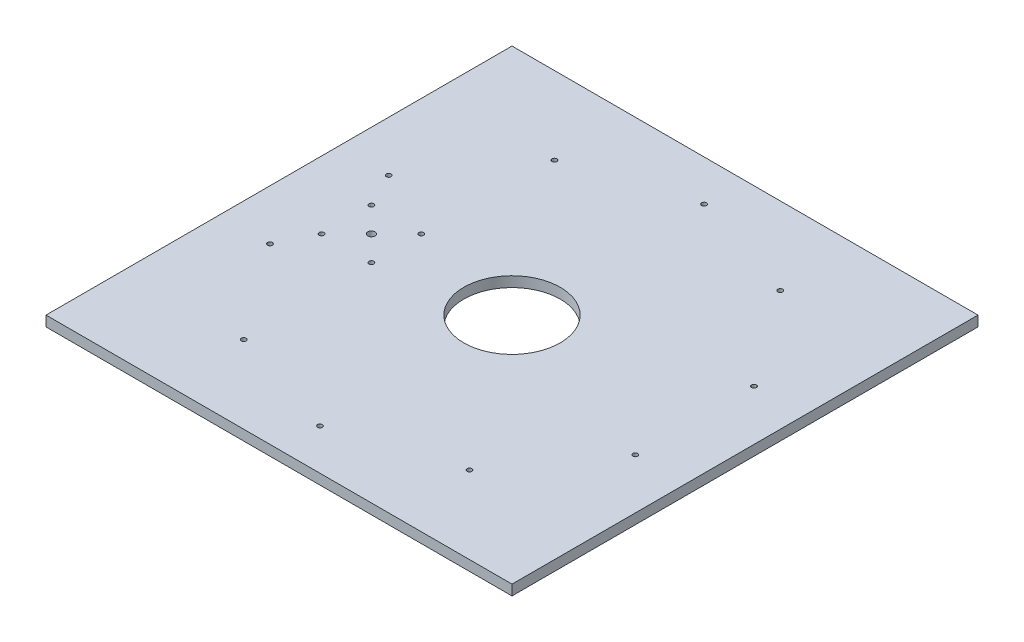
ISO-10303-21;
HEADER;
FILE_DESCRIPTION(('STEP AP214'),'2;1');
FILE_NAME('part.step','',(''),(''),'','','');
FILE_SCHEMA(('AUTOMOTIVE_DESIGN { 1 0 10303 214 1 1 1 1 }'));
ENDSEC;
DATA;
#1=APPLICATION_CONTEXT('core data for automotive mechanical design processes');
#2=APPLICATION_PROTOCOL_DEFINITION('international standard','automotive_design',2000,#1);
#3=PRODUCT_CONTEXT('',#1,'mechanical');
#4=PRODUCT('Part','Part','',(#3));
#5=PRODUCT_RELATED_PRODUCT_CATEGORY('part','',(#4));
#6=PRODUCT_DEFINITION_FORMATION('','',#4);
#7=PRODUCT_DEFINITION_CONTEXT('part definition',#1,'design');
#8=PRODUCT_DEFINITION('design','',#6,#7);
#9=PRODUCT_DEFINITION_SHAPE('','',#8);
#10=(LENGTH_UNIT() NAMED_UNIT(*) SI_UNIT(.MILLI.,.METRE.));
#11=(NAMED_UNIT(*) PLANE_ANGLE_UNIT() SI_UNIT($,.RADIAN.));
#12=(NAMED_UNIT(*) SI_UNIT($,.STERADIAN.) SOLID_ANGLE_UNIT());
#13=UNCERTAINTY_MEASURE_WITH_UNIT(LENGTH_MEASURE(1.E-05),#10,'distance_accuracy_value','');
#14=(GEOMETRIC_REPRESENTATION_CONTEXT(3) GLOBAL_UNCERTAINTY_ASSIGNED_CONTEXT((#13)) GLOBAL_UNIT_ASSIGNED_CONTEXT((#10,
#11,#12)) REPRESENTATION_CONTEXT('',''));
#15=CARTESIAN_POINT('',(0.,0.,0.));
#16=DIRECTION('',(0.,0.,1.));
#17=DIRECTION('',(1.,0.,0.));
#18=AXIS2_PLACEMENT_3D('',#15,#16,#17);
#19=CARTESIAN_POINT('',(-145.,6.4,145.));
#20=DIRECTION('',(1.,0.,0.));
#21=DIRECTION('',(0.,0.,-1.));
#22=AXIS2_PLACEMENT_3D('',#19,#20,#21);
#23=PLANE('',#22);
#24=DIRECTION('',(0.,0.,1.));
#25=VECTOR('',#24,1.);
#26=CARTESIAN_POINT('',(-145.,0.,145.));
#27=LINE('',#26,#25);
#28=CARTESIAN_POINT('',(-145.,0.,-145.));
#29=VERTEX_POINT('',#28);
#30=CARTESIAN_POINT('',(-145.,0.,145.));
#31=VERTEX_POINT('',#30);
#32=EDGE_CURVE('E111',#29,#31,#27,.T.);
#33=ORIENTED_EDGE('',*,*,#32,.T.);
#34=DIRECTION('',(0.,-1.,0.));
#35=VECTOR('',#34,1.);
#36=CARTESIAN_POINT('',(-145.,6.4,145.));
#37=LINE('',#36,#35);
#38=CARTESIAN_POINT('',(-145.,6.4,145.));
#39=VERTEX_POINT('',#38);
#40=EDGE_CURVE('E11',#39,#31,#37,.T.);
#41=ORIENTED_EDGE('',*,*,#40,.F.);
#42=DIRECTION('',(0.,0.,1.));
#43=VECTOR('',#42,1.);
#44=CARTESIAN_POINT('',(-145.,6.4,145.));
#45=LINE('',#44,#43);
#46=CARTESIAN_POINT('',(-145.,6.4,-145.));
#47=VERTEX_POINT('',#46);
#48=EDGE_CURVE('E95',#47,#39,#45,.T.);
#49=ORIENTED_EDGE('',*,*,#48,.F.);
#50=DIRECTION('',(0.,-1.,0.));
#51=VECTOR('',#50,1.);
#52=CARTESIAN_POINT('',(-145.,6.4,-145.));
#53=LINE('',#52,#51);
#54=EDGE_CURVE('E107',#47,#29,#53,.T.);
#55=ORIENTED_EDGE('',*,*,#54,.T.);
#56=EDGE_LOOP('',(#33,#41,#49,#55));
#57=FACE_BOUND('',#56,.T.);
#58=ADVANCED_FACE('F43',(#57),#23,.F.);
#59=CARTESIAN_POINT('',(145.,6.4,145.));
#60=DIRECTION('',(0.,0.,-1.));
#61=DIRECTION('',(-1.,0.,0.));
#62=AXIS2_PLACEMENT_3D('',#59,#60,#61);
#63=PLANE('',#62);
#64=DIRECTION('',(1.,0.,0.));
#65=VECTOR('',#64,1.);
#66=CARTESIAN_POINT('',(145.,0.,145.));
#67=LINE('',#66,#65);
#68=CARTESIAN_POINT('',(145.,0.,145.));
#69=VERTEX_POINT('',#68);
#70=EDGE_CURVE('E100',#31,#69,#67,.T.);
#71=ORIENTED_EDGE('',*,*,#70,.T.);
#72=DIRECTION('',(0.,-1.,0.));
#73=VECTOR('',#72,1.);
#74=CARTESIAN_POINT('',(145.,6.4,145.));
#75=LINE('',#74,#73);
#76=CARTESIAN_POINT('',(145.,6.4,145.));
#77=VERTEX_POINT('',#76);
#78=EDGE_CURVE('E52',#77,#69,#75,.T.);
#79=ORIENTED_EDGE('',*,*,#78,.F.);
#80=DIRECTION('',(1.,0.,0.));
#81=VECTOR('',#80,1.);
#82=CARTESIAN_POINT('',(145.,6.4,145.));
#83=LINE('',#82,#81);
#84=EDGE_CURVE('E90',#39,#77,#83,.T.);
#85=ORIENTED_EDGE('',*,*,#84,.F.);
#86=ORIENTED_EDGE('',*,*,#40,.T.);
#87=EDGE_LOOP('',(#71,#79,#85,#86));
#88=FACE_BOUND('',#87,.T.);
#89=ADVANCED_FACE('F99',(#88),#63,.F.);
#90=CARTESIAN_POINT('',(145.,6.4,145.));
#91=DIRECTION('',(-1.,0.,0.));
#92=DIRECTION('',(0.,0.,1.));
#93=AXIS2_PLACEMENT_3D('',#90,#91,#92);
#94=PLANE('',#93);
#95=DIRECTION('',(0.,0.,-1.));
#96=VECTOR('',#95,1.);
#97=CARTESIAN_POINT('',(145.,0.,145.));
#98=LINE('',#97,#96);
#99=CARTESIAN_POINT('',(145.,0.,-145.));
#100=VERTEX_POINT('',#99);
#101=EDGE_CURVE('E77',#69,#100,#98,.T.);
#102=ORIENTED_EDGE('',*,*,#101,.T.);
#103=DIRECTION('',(0.,-1.,0.));
#104=VECTOR('',#103,1.);
#105=CARTESIAN_POINT('',(145.,6.4,-145.));
#106=LINE('',#105,#104);
#107=CARTESIAN_POINT('',(145.,6.4,-145.));
#108=VERTEX_POINT('',#107);
#109=EDGE_CURVE('E102',#108,#100,#106,.T.);
#110=ORIENTED_EDGE('',*,*,#109,.F.);
#111=DIRECTION('',(0.,0.,-1.));
#112=VECTOR('',#111,1.);
#113=CARTESIAN_POINT('',(145.,6.4,145.));
#114=LINE('',#113,#112);
#115=EDGE_CURVE('E93',#77,#108,#114,.T.);
#116=ORIENTED_EDGE('',*,*,#115,.F.);
#117=ORIENTED_EDGE('',*,*,#78,.T.);
#118=EDGE_LOOP('',(#102,#110,#116,#117));
#119=FACE_BOUND('',#118,.T.);
#120=ADVANCED_FACE('F103',(#119),#94,.F.);
#121=CARTESIAN_POINT('',(145.,6.4,-145.));
#122=DIRECTION('',(0.,0.,1.));
#123=DIRECTION('',(1.,0.,0.));
#124=AXIS2_PLACEMENT_3D('',#121,#122,#123);
#125=PLANE('',#124);
#126=DIRECTION('',(-1.,0.,0.));
#127=VECTOR('',#126,1.);
#128=CARTESIAN_POINT('',(145.,0.,-145.));
#129=LINE('',#128,#127);
#130=EDGE_CURVE('E83',#100,#29,#129,.T.);
#131=ORIENTED_EDGE('',*,*,#130,.T.);
#132=ORIENTED_EDGE('',*,*,#54,.F.);
#133=DIRECTION('',(-1.,0.,0.));
#134=VECTOR('',#133,1.);
#135=CARTESIAN_POINT('',(145.,6.4,-145.));
#136=LINE('',#135,#134);
#137=EDGE_CURVE('E60',#108,#47,#136,.T.);
#138=ORIENTED_EDGE('',*,*,#137,.F.);
#139=ORIENTED_EDGE('',*,*,#109,.T.);
#140=EDGE_LOOP('',(#131,#132,#138,#139));
#141=FACE_BOUND('',#140,.T.);
#142=ADVANCED_FACE('F125',(#141),#125,.F.);
#143=CARTESIAN_POINT('',(0.,6.4,0.));
#144=DIRECTION('',(0.,1.,0.));
#145=DIRECTION('',(0.,0.,1.));
#146=AXIS2_PLACEMENT_3D('',#143,#144,#145);
#147=PLANE('',#146);
#148=CARTESIAN_POINT('',(0.,6.4,-119.525));
#149=DIRECTION('',(0.,1.,0.));
#150=DIRECTION('',(0.,0.,1.));
#151=AXIS2_PLACEMENT_3D('',#148,#149,#150);
#152=CIRCLE('',#151,1.5);
#153=CARTESIAN_POINT('',(0.,6.4,-118.025));
#154=VERTEX_POINT('',#153);
#155=EDGE_CURVE('E136',#154,#154,#152,.T.);
#156=ORIENTED_EDGE('',*,*,#155,.F.);
#157=EDGE_LOOP('',(#156));
#158=FACE_BOUND('',#157,.T.);
#159=CARTESIAN_POINT('',(-87.5,6.4,0.));
#160=DIRECTION('',(0.,1.,0.));
#161=DIRECTION('',(0.,0.,1.));
#162=AXIS2_PLACEMENT_3D('',#159,#160,#161);
#163=CIRCLE('',#162,2.25);
#164=CARTESIAN_POINT('',(-87.5,6.4,2.25));
#165=VERTEX_POINT('',#164);
#166=EDGE_CURVE('E193',#165,#165,#163,.T.);
#167=ORIENTED_EDGE('',*,*,#166,.F.);
#168=EDGE_LOOP('',(#167));
#169=FACE_BOUND('',#168,.T.);
#170=CARTESIAN_POINT('',(70.2550322802588,6.4,-96.6977562526686));
#171=DIRECTION('',(0.,1.,0.));
#172=DIRECTION('',(0.,0.,1.));
#173=AXIS2_PLACEMENT_3D('',#170,#171,#172);
#174=CIRCLE('',#173,1.50000000000022);
#175=CARTESIAN_POINT('',(70.2550322802588,6.4,-95.1977562526684));
#176=VERTEX_POINT('',#175);
#177=EDGE_CURVE('E185',#176,#176,#174,.T.);
#178=ORIENTED_EDGE('',*,*,#177,.F.);
#179=EDGE_LOOP('',(#178));
#180=FACE_BOUND('',#179,.T.);
#181=CARTESIAN_POINT('',(113.675030110182,6.4,-36.9352562526704));
#182=DIRECTION('',(0.,1.,0.));
#183=DIRECTION('',(0.,0.,1.));
#184=AXIS2_PLACEMENT_3D('',#181,#182,#183);
#185=CIRCLE('',#184,1.50000000000228);
#186=CARTESIAN_POINT('',(113.675030110182,6.4,-35.4352562526681));
#187=VERTEX_POINT('',#186);
#188=EDGE_CURVE('E177',#187,#187,#185,.T.);
#189=ORIENTED_EDGE('',*,*,#188,.F.);
#190=EDGE_LOOP('',(#189));
#191=FACE_BOUND('',#190,.T.);
#192=CARTESIAN_POINT('',(113.675030110185,6.4,36.9352562526608));
#193=DIRECTION('',(0.,1.,0.));
#194=DIRECTION('',(0.,0.,1.));
#195=AXIS2_PLACEMENT_3D('',#192,#193,#194);
#196=CIRCLE('',#195,1.50000000000544);
#197=CARTESIAN_POINT('',(113.675030110185,6.4,38.4352562526662));
#198=VERTEX_POINT('',#197);
#199=EDGE_CURVE('E169',#198,#198,#196,.T.);
#200=ORIENTED_EDGE('',*,*,#199,.F.);
#201=EDGE_LOOP('',(#200));
#202=FACE_BOUND('',#201,.T.);
#203=CARTESIAN_POINT('',(70.255032280267,6.4,96.6977562526626));
#204=DIRECTION('',(0.,1.,0.));
#205=DIRECTION('',(0.,0.,1.));
#206=AXIS2_PLACEMENT_3D('',#203,#204,#205);
#207=CIRCLE('',#206,1.50000000000855);
#208=CARTESIAN_POINT('',(70.255032280267,6.4,98.1977562526712));
#209=VERTEX_POINT('',#208);
#210=EDGE_CURVE('E161',#209,#209,#207,.T.);
#211=ORIENTED_EDGE('',*,*,#210,.F.);
#212=EDGE_LOOP('',(#211));
#213=FACE_BOUND('',#212,.T.);
#214=CARTESIAN_POINT('',(1.01467311922842E-11,6.4,119.525));
#215=DIRECTION('',(0.,1.,0.));
#216=DIRECTION('',(0.,0.,1.));
#217=AXIS2_PLACEMENT_3D('',#214,#215,#216);
#218=CIRCLE('',#217,1.5000000000105);
#219=CARTESIAN_POINT('',(1.01467311922842E-11,6.4,121.025000000011));
#220=VERTEX_POINT('',#219);
#221=EDGE_CURVE('E153',#220,#220,#218,.T.);
#222=ORIENTED_EDGE('',*,*,#221,.F.);
#223=EDGE_LOOP('',(#222));
#224=FACE_BOUND('',#223,.T.);
#225=CARTESIAN_POINT('',(-70.2550322802487,6.4,96.6977562526686));
#226=DIRECTION('',(0.,1.,0.));
#227=DIRECTION('',(0.,0.,1.));
#228=AXIS2_PLACEMENT_3D('',#225,#226,#227);
#229=CIRCLE('',#228,1.50000000001064);
#230=CARTESIAN_POINT('',(-70.2550322802487,6.4,98.1977562526792));
#231=VERTEX_POINT('',#230);
#232=EDGE_CURVE('E144',#231,#231,#229,.T.);
#233=ORIENTED_EDGE('',*,*,#232,.F.);
#234=EDGE_LOOP('',(#233));
#235=FACE_BOUND('',#234,.T.);
#236=CARTESIAN_POINT('',(-103.,6.4,15.5));
#237=DIRECTION('',(0.,1.,0.));
#238=DIRECTION('',(0.,0.,1.));
#239=AXIS2_PLACEMENT_3D('',#236,#237,#238);
#240=CIRCLE('',#239,1.5);
#241=CARTESIAN_POINT('',(-103.,6.4,17.));
#242=VERTEX_POINT('',#241);
#243=EDGE_CURVE('E240',#242,#242,#240,.T.);
#244=ORIENTED_EDGE('',*,*,#243,.F.);
#245=EDGE_LOOP('',(#244));
#246=FACE_BOUND('',#245,.T.);
#247=CARTESIAN_POINT('',(-72.,6.4,15.5));
#248=DIRECTION('',(0.,1.,0.));
#249=DIRECTION('',(0.,0.,1.));
#250=AXIS2_PLACEMENT_3D('',#247,#248,#249);
#251=CIRCLE('',#250,1.5);
#252=CARTESIAN_POINT('',(-72.,6.4,17.));
#253=VERTEX_POINT('',#252);
#254=EDGE_CURVE('E248',#253,#253,#251,.T.);
#255=ORIENTED_EDGE('',*,*,#254,.F.);
#256=EDGE_LOOP('',(#255));
#257=FACE_BOUND('',#256,.T.);
#258=CARTESIAN_POINT('',(-72.,6.4,-15.5));
#259=DIRECTION('',(0.,1.,0.));
#260=DIRECTION('',(0.,0.,1.));
#261=AXIS2_PLACEMENT_3D('',#258,#259,#260);
#262=CIRCLE('',#261,1.50000000000001);
#263=CARTESIAN_POINT('',(-72.,6.4,-14.));
#264=VERTEX_POINT('',#263);
#265=EDGE_CURVE('E209',#264,#264,#262,.T.);
#266=ORIENTED_EDGE('',*,*,#265,.F.);
#267=EDGE_LOOP('',(#266));
#268=FACE_BOUND('',#267,.T.);
#269=CARTESIAN_POINT('',(-103.,6.4,-15.5));
#270=DIRECTION('',(0.,1.,0.));
#271=DIRECTION('',(0.,0.,1.));
#272=AXIS2_PLACEMENT_3D('',#269,#270,#271);
#273=CIRCLE('',#272,1.5);
#274=CARTESIAN_POINT('',(-103.,6.4,-14.));
#275=VERTEX_POINT('',#274);
#276=EDGE_CURVE('E208',#275,#275,#273,.T.);
#277=ORIENTED_EDGE('',*,*,#276,.F.);
#278=EDGE_LOOP('',(#277));
#279=FACE_BOUND('',#278,.T.);
#280=CARTESIAN_POINT('',(-70.2550322802569,6.4,-96.6977562526626));
#281=DIRECTION('',(0.,1.,0.));
#282=DIRECTION('',(0.,0.,1.));
#283=AXIS2_PLACEMENT_3D('',#280,#281,#282);
#284=CIRCLE('',#283,1.50000000000331);
#285=CARTESIAN_POINT('',(-70.2550322802569,6.4,-95.1977562526593));
#286=VERTEX_POINT('',#285);
#287=EDGE_CURVE('E217',#286,#286,#284,.T.);
#288=ORIENTED_EDGE('',*,*,#287,.F.);
#289=EDGE_LOOP('',(#288));
#290=FACE_BOUND('',#289,.T.);
#291=CARTESIAN_POINT('',(-113.675030110175,6.4,-36.9352562526607));
#292=DIRECTION('',(0.,1.,0.));
#293=DIRECTION('',(0.,0.,1.));
#294=AXIS2_PLACEMENT_3D('',#291,#292,#293);
#295=CIRCLE('',#294,1.50000000000608);
#296=CARTESIAN_POINT('',(-113.675030110175,6.4,-35.4352562526547));
#297=VERTEX_POINT('',#296);
#298=EDGE_CURVE('E225',#297,#297,#295,.T.);
#299=ORIENTED_EDGE('',*,*,#298,.F.);
#300=EDGE_LOOP('',(#299));
#301=FACE_BOUND('',#300,.T.);
#302=CARTESIAN_POINT('',(-113.675030110172,6.4,36.9352562526704));
#303=DIRECTION('',(0.,1.,0.));
#304=DIRECTION('',(0.,0.,1.));
#305=AXIS2_PLACEMENT_3D('',#302,#303,#304);
#306=CIRCLE('',#305,1.50000000000887);
#307=CARTESIAN_POINT('',(-113.675030110172,6.4,38.4352562526793));
#308=VERTEX_POINT('',#307);
#309=EDGE_CURVE('E145',#308,#308,#306,.T.);
#310=ORIENTED_EDGE('',*,*,#309,.F.);
#311=EDGE_LOOP('',(#310));
#312=FACE_BOUND('',#311,.T.);
#313=CARTESIAN_POINT('',(0.,6.4,0.));
#314=DIRECTION('',(0.,1.,0.));
#315=DIRECTION('',(0.,0.,1.));
#316=AXIS2_PLACEMENT_3D('',#313,#314,#315);
#317=CIRCLE('',#316,30.);
#318=CARTESIAN_POINT('',(0.,6.4,30.));
#319=VERTEX_POINT('',#318);
#320=EDGE_CURVE('E132',#319,#319,#317,.T.);
#321=ORIENTED_EDGE('',*,*,#320,.F.);
#322=EDGE_LOOP('',(#321));
#323=FACE_BOUND('',#322,.T.);
#324=ORIENTED_EDGE('',*,*,#48,.T.);
#325=ORIENTED_EDGE('',*,*,#84,.T.);
#326=ORIENTED_EDGE('',*,*,#115,.T.);
#327=ORIENTED_EDGE('',*,*,#137,.T.);
#328=EDGE_LOOP('',(#324,#325,#326,#327));
#329=FACE_BOUND('',#328,.T.);
#330=ADVANCED_FACE('F91',(#158,#169,#180,#191,#202,#213,#224,#235,#246,#257,#268,#279,#290,#301,
#312,#323,#329),#147,.T.);
#331=CARTESIAN_POINT('',(0.,0.,0.));
#332=DIRECTION('',(0.,1.,0.));
#333=DIRECTION('',(0.,0.,1.));
#334=AXIS2_PLACEMENT_3D('',#331,#332,#333);
#335=PLANE('',#334);
#336=CARTESIAN_POINT('',(0.,0.,-119.525));
#337=DIRECTION('',(0.,1.,0.));
#338=DIRECTION('',(0.,0.,1.));
#339=AXIS2_PLACEMENT_3D('',#336,#337,#338);
#340=CIRCLE('',#339,1.5);
#341=CARTESIAN_POINT('',(0.,0.,-118.025));
#342=VERTEX_POINT('',#341);
#343=EDGE_CURVE('E197',#342,#342,#340,.T.);
#344=ORIENTED_EDGE('',*,*,#343,.T.);
#345=EDGE_LOOP('',(#344));
#346=FACE_BOUND('',#345,.T.);
#347=CARTESIAN_POINT('',(-87.5,0.,0.));
#348=DIRECTION('',(0.,1.,0.));
#349=DIRECTION('',(0.,0.,1.));
#350=AXIS2_PLACEMENT_3D('',#347,#348,#349);
#351=CIRCLE('',#350,2.25);
#352=CARTESIAN_POINT('',(-87.5,0.,2.25));
#353=VERTEX_POINT('',#352);
#354=EDGE_CURVE('E189',#353,#353,#351,.T.);
#355=ORIENTED_EDGE('',*,*,#354,.T.);
#356=EDGE_LOOP('',(#355));
#357=FACE_BOUND('',#356,.T.);
#358=CARTESIAN_POINT('',(70.2550322802588,0.,-96.6977562526686));
#359=DIRECTION('',(0.,1.,0.));
#360=DIRECTION('',(0.,0.,1.));
#361=AXIS2_PLACEMENT_3D('',#358,#359,#360);
#362=CIRCLE('',#361,1.50000000000022);
#363=CARTESIAN_POINT('',(70.2550322802588,0.,-95.1977562526684));
#364=VERTEX_POINT('',#363);
#365=EDGE_CURVE('E181',#364,#364,#362,.T.);
#366=ORIENTED_EDGE('',*,*,#365,.T.);
#367=EDGE_LOOP('',(#366));
#368=FACE_BOUND('',#367,.T.);
#369=CARTESIAN_POINT('',(113.675030110182,0.,-36.9352562526704));
#370=DIRECTION('',(0.,1.,0.));
#371=DIRECTION('',(0.,0.,1.));
#372=AXIS2_PLACEMENT_3D('',#369,#370,#371);
#373=CIRCLE('',#372,1.50000000000228);
#374=CARTESIAN_POINT('',(113.675030110182,0.,-35.4352562526681));
#375=VERTEX_POINT('',#374);
#376=EDGE_CURVE('E173',#375,#375,#373,.T.);
#377=ORIENTED_EDGE('',*,*,#376,.T.);
#378=EDGE_LOOP('',(#377));
#379=FACE_BOUND('',#378,.T.);
#380=CARTESIAN_POINT('',(113.675030110185,0.,36.9352562526608));
#381=DIRECTION('',(0.,1.,0.));
#382=DIRECTION('',(0.,0.,1.));
#383=AXIS2_PLACEMENT_3D('',#380,#381,#382);
#384=CIRCLE('',#383,1.50000000000544);
#385=CARTESIAN_POINT('',(113.675030110185,0.,38.4352562526662));
#386=VERTEX_POINT('',#385);
#387=EDGE_CURVE('E165',#386,#386,#384,.T.);
#388=ORIENTED_EDGE('',*,*,#387,.T.);
#389=EDGE_LOOP('',(#388));
#390=FACE_BOUND('',#389,.T.);
#391=CARTESIAN_POINT('',(70.255032280267,0.,96.6977562526626));
#392=DIRECTION('',(0.,1.,0.));
#393=DIRECTION('',(0.,0.,1.));
#394=AXIS2_PLACEMENT_3D('',#391,#392,#393);
#395=CIRCLE('',#394,1.50000000000855);
#396=CARTESIAN_POINT('',(70.255032280267,0.,98.1977562526712));
#397=VERTEX_POINT('',#396);
#398=EDGE_CURVE('E157',#397,#397,#395,.T.);
#399=ORIENTED_EDGE('',*,*,#398,.T.);
#400=EDGE_LOOP('',(#399));
#401=FACE_BOUND('',#400,.T.);
#402=CARTESIAN_POINT('',(1.01467311922842E-11,0.,119.525));
#403=DIRECTION('',(0.,1.,0.));
#404=DIRECTION('',(0.,0.,1.));
#405=AXIS2_PLACEMENT_3D('',#402,#403,#404);
#406=CIRCLE('',#405,1.5000000000105);
#407=CARTESIAN_POINT('',(1.01467311922842E-11,0.,121.025000000011));
#408=VERTEX_POINT('',#407);
#409=EDGE_CURVE('E149',#408,#408,#406,.T.);
#410=ORIENTED_EDGE('',*,*,#409,.T.);
#411=EDGE_LOOP('',(#410));
#412=FACE_BOUND('',#411,.T.);
#413=CARTESIAN_POINT('',(-70.2550322802487,0.,96.6977562526686));
#414=DIRECTION('',(0.,1.,0.));
#415=DIRECTION('',(0.,0.,1.));
#416=AXIS2_PLACEMENT_3D('',#413,#414,#415);
#417=CIRCLE('',#416,1.50000000001064);
#418=CARTESIAN_POINT('',(-70.2550322802487,0.,98.1977562526792));
#419=VERTEX_POINT('',#418);
#420=EDGE_CURVE('E140',#419,#419,#417,.T.);
#421=ORIENTED_EDGE('',*,*,#420,.T.);
#422=EDGE_LOOP('',(#421));
#423=FACE_BOUND('',#422,.T.);
#424=CARTESIAN_POINT('',(-103.,0.,15.5));
#425=DIRECTION('',(0.,1.,0.));
#426=DIRECTION('',(0.,0.,1.));
#427=AXIS2_PLACEMENT_3D('',#424,#425,#426);
#428=CIRCLE('',#427,1.5);
#429=CARTESIAN_POINT('',(-103.,0.,17.));
#430=VERTEX_POINT('',#429);
#431=EDGE_CURVE('E236',#430,#430,#428,.T.);
#432=ORIENTED_EDGE('',*,*,#431,.T.);
#433=EDGE_LOOP('',(#432));
#434=FACE_BOUND('',#433,.T.);
#435=CARTESIAN_POINT('',(-72.,0.,15.5));
#436=DIRECTION('',(0.,1.,0.));
#437=DIRECTION('',(0.,0.,1.));
#438=AXIS2_PLACEMENT_3D('',#435,#436,#437);
#439=CIRCLE('',#438,1.5);
#440=CARTESIAN_POINT('',(-72.,0.,17.));
#441=VERTEX_POINT('',#440);
#442=EDGE_CURVE('E244',#441,#441,#439,.T.);
#443=ORIENTED_EDGE('',*,*,#442,.T.);
#444=EDGE_LOOP('',(#443));
#445=FACE_BOUND('',#444,.T.);
#446=CARTESIAN_POINT('',(-72.,0.,-15.5));
#447=DIRECTION('',(0.,1.,0.));
#448=DIRECTION('',(0.,0.,1.));
#449=AXIS2_PLACEMENT_3D('',#446,#447,#448);
#450=CIRCLE('',#449,1.50000000000001);
#451=CARTESIAN_POINT('',(-72.,0.,-14.));
#452=VERTEX_POINT('',#451);
#453=EDGE_CURVE('E252',#452,#452,#450,.T.);
#454=ORIENTED_EDGE('',*,*,#453,.T.);
#455=EDGE_LOOP('',(#454));
#456=FACE_BOUND('',#455,.T.);
#457=CARTESIAN_POINT('',(-103.,0.,-15.5));
#458=DIRECTION('',(0.,1.,0.));
#459=DIRECTION('',(0.,0.,1.));
#460=AXIS2_PLACEMENT_3D('',#457,#458,#459);
#461=CIRCLE('',#460,1.5);
#462=CARTESIAN_POINT('',(-103.,0.,-14.));
#463=VERTEX_POINT('',#462);
#464=EDGE_CURVE('E204',#463,#463,#461,.T.);
#465=ORIENTED_EDGE('',*,*,#464,.T.);
#466=EDGE_LOOP('',(#465));
#467=FACE_BOUND('',#466,.T.);
#468=CARTESIAN_POINT('',(-70.2550322802569,0.,-96.6977562526626));
#469=DIRECTION('',(0.,1.,0.));
#470=DIRECTION('',(0.,0.,1.));
#471=AXIS2_PLACEMENT_3D('',#468,#469,#470);
#472=CIRCLE('',#471,1.50000000000331);
#473=CARTESIAN_POINT('',(-70.2550322802569,0.,-95.1977562526593));
#474=VERTEX_POINT('',#473);
#475=EDGE_CURVE('E213',#474,#474,#472,.T.);
#476=ORIENTED_EDGE('',*,*,#475,.T.);
#477=EDGE_LOOP('',(#476));
#478=FACE_BOUND('',#477,.T.);
#479=CARTESIAN_POINT('',(-113.675030110175,0.,-36.9352562526607));
#480=DIRECTION('',(0.,1.,0.));
#481=DIRECTION('',(0.,0.,1.));
#482=AXIS2_PLACEMENT_3D('',#479,#480,#481);
#483=CIRCLE('',#482,1.50000000000608);
#484=CARTESIAN_POINT('',(-113.675030110175,0.,-35.4352562526547));
#485=VERTEX_POINT('',#484);
#486=EDGE_CURVE('E221',#485,#485,#483,.T.);
#487=ORIENTED_EDGE('',*,*,#486,.T.);
#488=EDGE_LOOP('',(#487));
#489=FACE_BOUND('',#488,.T.);
#490=CARTESIAN_POINT('',(-113.675030110172,0.,36.9352562526704));
#491=DIRECTION('',(0.,1.,0.));
#492=DIRECTION('',(0.,0.,1.));
#493=AXIS2_PLACEMENT_3D('',#490,#491,#492);
#494=CIRCLE('',#493,1.50000000000887);
#495=CARTESIAN_POINT('',(-113.675030110172,0.,38.4352562526793));
#496=VERTEX_POINT('',#495);
#497=EDGE_CURVE('E229',#496,#496,#494,.T.);
#498=ORIENTED_EDGE('',*,*,#497,.T.);
#499=EDGE_LOOP('',(#498));
#500=FACE_BOUND('',#499,.T.);
#501=CARTESIAN_POINT('',(0.,0.,0.));
#502=DIRECTION('',(0.,1.,0.));
#503=DIRECTION('',(0.,0.,1.));
#504=AXIS2_PLACEMENT_3D('',#501,#502,#503);
#505=CIRCLE('',#504,30.);
#506=CARTESIAN_POINT('',(0.,0.,30.));
#507=VERTEX_POINT('',#506);
#508=EDGE_CURVE('E115',#507,#507,#505,.T.);
#509=ORIENTED_EDGE('',*,*,#508,.T.);
#510=EDGE_LOOP('',(#509));
#511=FACE_BOUND('',#510,.T.);
#512=ORIENTED_EDGE('',*,*,#32,.F.);
#513=ORIENTED_EDGE('',*,*,#130,.F.);
#514=ORIENTED_EDGE('',*,*,#101,.F.);
#515=ORIENTED_EDGE('',*,*,#70,.F.);
#516=EDGE_LOOP('',(#512,#513,#514,#515));
#517=FACE_BOUND('',#516,.T.);
#518=ADVANCED_FACE('F128',(#346,#357,#368,#379,#390,#401,#412,#423,#434,#445,#456,#467,#478,
#489,#500,#511,#517),#335,.F.);
#519=CARTESIAN_POINT('',(0.,0.,0.));
#520=DIRECTION('',(0.,1.,0.));
#521=DIRECTION('',(0.,0.,1.));
#522=AXIS2_PLACEMENT_3D('',#519,#520,#521);
#523=CYLINDRICAL_SURFACE('',#522,30.);
#524=ORIENTED_EDGE('',*,*,#508,.F.);
#525=EDGE_LOOP('',(#524));
#526=FACE_BOUND('',#525,.T.);
#527=ORIENTED_EDGE('',*,*,#320,.T.);
#528=EDGE_LOOP('',(#527));
#529=FACE_BOUND('',#528,.T.);
#530=ADVANCED_FACE('F276',(#526,#529),#523,.F.);
#531=CARTESIAN_POINT('',(-113.675030110172,0.,36.9352562526704));
#532=DIRECTION('',(0.,1.,0.));
#533=DIRECTION('',(0.,0.,1.));
#534=AXIS2_PLACEMENT_3D('',#531,#532,#533);
#535=CYLINDRICAL_SURFACE('',#534,1.50000000000887);
#536=ORIENTED_EDGE('',*,*,#497,.F.);
#537=EDGE_LOOP('',(#536));
#538=FACE_BOUND('',#537,.T.);
#539=ORIENTED_EDGE('',*,*,#309,.T.);
#540=EDGE_LOOP('',(#539));
#541=FACE_BOUND('',#540,.T.);
#542=ADVANCED_FACE('F278',(#538,#541),#535,.F.);
#543=CARTESIAN_POINT('',(-113.675030110175,0.,-36.9352562526607));
#544=DIRECTION('',(0.,1.,0.));
#545=DIRECTION('',(0.,0.,1.));
#546=AXIS2_PLACEMENT_3D('',#543,#544,#545);
#547=CYLINDRICAL_SURFACE('',#546,1.50000000000608);
#548=ORIENTED_EDGE('',*,*,#486,.F.);
#549=EDGE_LOOP('',(#548));
#550=FACE_BOUND('',#549,.T.);
#551=ORIENTED_EDGE('',*,*,#298,.T.);
#552=EDGE_LOOP('',(#551));
#553=FACE_BOUND('',#552,.T.);
#554=ADVANCED_FACE('F285',(#550,#553),#547,.F.);
#555=CARTESIAN_POINT('',(-70.2550322802569,0.,-96.6977562526626));
#556=DIRECTION('',(0.,1.,0.));
#557=DIRECTION('',(0.,0.,1.));
#558=AXIS2_PLACEMENT_3D('',#555,#556,#557);
#559=CYLINDRICAL_SURFACE('',#558,1.50000000000331);
#560=ORIENTED_EDGE('',*,*,#475,.F.);
#561=EDGE_LOOP('',(#560));
#562=FACE_BOUND('',#561,.T.);
#563=ORIENTED_EDGE('',*,*,#287,.T.);
#564=EDGE_LOOP('',(#563));
#565=FACE_BOUND('',#564,.T.);
#566=ADVANCED_FACE('F336',(#562,#565),#559,.F.);
#567=CARTESIAN_POINT('',(-103.,0.,-15.5));
#568=DIRECTION('',(0.,1.,0.));
#569=DIRECTION('',(0.,0.,1.));
#570=AXIS2_PLACEMENT_3D('',#567,#568,#569);
#571=CYLINDRICAL_SURFACE('',#570,1.5);
#572=ORIENTED_EDGE('',*,*,#464,.F.);
#573=EDGE_LOOP('',(#572));
#574=FACE_BOUND('',#573,.T.);
#575=ORIENTED_EDGE('',*,*,#276,.T.);
#576=EDGE_LOOP('',(#575));
#577=FACE_BOUND('',#576,.T.);
#578=ADVANCED_FACE('F347',(#574,#577),#571,.F.);
#579=CARTESIAN_POINT('',(-72.,0.,-15.5));
#580=DIRECTION('',(0.,1.,0.));
#581=DIRECTION('',(0.,0.,1.));
#582=AXIS2_PLACEMENT_3D('',#579,#580,#581);
#583=CYLINDRICAL_SURFACE('',#582,1.50000000000001);
#584=ORIENTED_EDGE('',*,*,#453,.F.);
#585=EDGE_LOOP('',(#584));
#586=FACE_BOUND('',#585,.T.);
#587=ORIENTED_EDGE('',*,*,#265,.T.);
#588=EDGE_LOOP('',(#587));
#589=FACE_BOUND('',#588,.T.);
#590=ADVANCED_FACE('F260',(#586,#589),#583,.F.);
#591=CARTESIAN_POINT('',(-72.,0.,15.5));
#592=DIRECTION('',(0.,1.,0.));
#593=DIRECTION('',(0.,0.,1.));
#594=AXIS2_PLACEMENT_3D('',#591,#592,#593);
#595=CYLINDRICAL_SURFACE('',#594,1.5);
#596=ORIENTED_EDGE('',*,*,#442,.F.);
#597=EDGE_LOOP('',(#596));
#598=FACE_BOUND('',#597,.T.);
#599=ORIENTED_EDGE('',*,*,#254,.T.);
#600=EDGE_LOOP('',(#599));
#601=FACE_BOUND('',#600,.T.);
#602=ADVANCED_FACE('F368',(#598,#601),#595,.F.);
#603=CARTESIAN_POINT('',(-103.,0.,15.5));
#604=DIRECTION('',(0.,1.,0.));
#605=DIRECTION('',(0.,0.,1.));
#606=AXIS2_PLACEMENT_3D('',#603,#604,#605);
#607=CYLINDRICAL_SURFACE('',#606,1.5);
#608=ORIENTED_EDGE('',*,*,#431,.F.);
#609=EDGE_LOOP('',(#608));
#610=FACE_BOUND('',#609,.T.);
#611=ORIENTED_EDGE('',*,*,#243,.T.);
#612=EDGE_LOOP('',(#611));
#613=FACE_BOUND('',#612,.T.);
#614=ADVANCED_FACE('F379',(#610,#613),#607,.F.);
#615=CARTESIAN_POINT('',(-70.2550322802487,0.,96.6977562526686));
#616=DIRECTION('',(0.,1.,0.));
#617=DIRECTION('',(0.,0.,1.));
#618=AXIS2_PLACEMENT_3D('',#615,#616,#617);
#619=CYLINDRICAL_SURFACE('',#618,1.50000000001064);
#620=ORIENTED_EDGE('',*,*,#420,.F.);
#621=EDGE_LOOP('',(#620));
#622=FACE_BOUND('',#621,.T.);
#623=ORIENTED_EDGE('',*,*,#232,.T.);
#624=EDGE_LOOP('',(#623));
#625=FACE_BOUND('',#624,.T.);
#626=ADVANCED_FACE('F390',(#622,#625),#619,.F.);
#627=CARTESIAN_POINT('',(1.01467311922842E-11,0.,119.525));
#628=DIRECTION('',(0.,1.,0.));
#629=DIRECTION('',(0.,0.,1.));
#630=AXIS2_PLACEMENT_3D('',#627,#628,#629);
#631=CYLINDRICAL_SURFACE('',#630,1.5000000000105);
#632=ORIENTED_EDGE('',*,*,#409,.F.);
#633=EDGE_LOOP('',(#632));
#634=FACE_BOUND('',#633,.T.);
#635=ORIENTED_EDGE('',*,*,#221,.T.);
#636=EDGE_LOOP('',(#635));
#637=FACE_BOUND('',#636,.T.);
#638=ADVANCED_FACE('F401',(#634,#637),#631,.F.);
#639=CARTESIAN_POINT('',(70.255032280267,0.,96.6977562526626));
#640=DIRECTION('',(0.,1.,0.));
#641=DIRECTION('',(0.,0.,1.));
#642=AXIS2_PLACEMENT_3D('',#639,#640,#641);
#643=CYLINDRICAL_SURFACE('',#642,1.50000000000855);
#644=ORIENTED_EDGE('',*,*,#398,.F.);
#645=EDGE_LOOP('',(#644));
#646=FACE_BOUND('',#645,.T.);
#647=ORIENTED_EDGE('',*,*,#210,.T.);
#648=EDGE_LOOP('',(#647));
#649=FACE_BOUND('',#648,.T.);
#650=ADVANCED_FACE('F411',(#646,#649),#643,.F.);
#651=CARTESIAN_POINT('',(113.675030110185,0.,36.9352562526608));
#652=DIRECTION('',(0.,1.,0.));
#653=DIRECTION('',(0.,0.,1.));
#654=AXIS2_PLACEMENT_3D('',#651,#652,#653);
#655=CYLINDRICAL_SURFACE('',#654,1.50000000000544);
#656=ORIENTED_EDGE('',*,*,#387,.F.);
#657=EDGE_LOOP('',(#656));
#658=FACE_BOUND('',#657,.T.);
#659=ORIENTED_EDGE('',*,*,#199,.T.);
#660=EDGE_LOOP('',(#659));
#661=FACE_BOUND('',#660,.T.);
#662=ADVANCED_FACE('F422',(#658,#661),#655,.F.);
#663=CARTESIAN_POINT('',(113.675030110182,0.,-36.9352562526704));
#664=DIRECTION('',(0.,1.,0.));
#665=DIRECTION('',(0.,0.,1.));
#666=AXIS2_PLACEMENT_3D('',#663,#664,#665);
#667=CYLINDRICAL_SURFACE('',#666,1.50000000000228);
#668=ORIENTED_EDGE('',*,*,#376,.F.);
#669=EDGE_LOOP('',(#668));
#670=FACE_BOUND('',#669,.T.);
#671=ORIENTED_EDGE('',*,*,#188,.T.);
#672=EDGE_LOOP('',(#671));
#673=FACE_BOUND('',#672,.T.);
#674=ADVANCED_FACE('F433',(#670,#673),#667,.F.);
#675=CARTESIAN_POINT('',(70.2550322802588,0.,-96.6977562526686));
#676=DIRECTION('',(0.,1.,0.));
#677=DIRECTION('',(0.,0.,1.));
#678=AXIS2_PLACEMENT_3D('',#675,#676,#677);
#679=CYLINDRICAL_SURFACE('',#678,1.50000000000022);
#680=ORIENTED_EDGE('',*,*,#365,.F.);
#681=EDGE_LOOP('',(#680));
#682=FACE_BOUND('',#681,.T.);
#683=ORIENTED_EDGE('',*,*,#177,.T.);
#684=EDGE_LOOP('',(#683));
#685=FACE_BOUND('',#684,.T.);
#686=ADVANCED_FACE('F444',(#682,#685),#679,.F.);
#687=CARTESIAN_POINT('',(-87.5,0.,0.));
#688=DIRECTION('',(0.,1.,0.));
#689=DIRECTION('',(0.,0.,1.));
#690=AXIS2_PLACEMENT_3D('',#687,#688,#689);
#691=CYLINDRICAL_SURFACE('',#690,2.25);
#692=ORIENTED_EDGE('',*,*,#354,.F.);
#693=EDGE_LOOP('',(#692));
#694=FACE_BOUND('',#693,.T.);
#695=ORIENTED_EDGE('',*,*,#166,.T.);
#696=EDGE_LOOP('',(#695));
#697=FACE_BOUND('',#696,.T.);
#698=ADVANCED_FACE('F455',(#694,#697),#691,.F.);
#699=CARTESIAN_POINT('',(0.,0.,-119.525));
#700=DIRECTION('',(0.,1.,0.));
#701=DIRECTION('',(0.,0.,1.));
#702=AXIS2_PLACEMENT_3D('',#699,#700,#701);
#703=CYLINDRICAL_SURFACE('',#702,1.5);
#704=ORIENTED_EDGE('',*,*,#343,.F.);
#705=EDGE_LOOP('',(#704));
#706=FACE_BOUND('',#705,.T.);
#707=ORIENTED_EDGE('',*,*,#155,.T.);
#708=EDGE_LOOP('',(#707));
#709=FACE_BOUND('',#708,.T.);
#710=ADVANCED_FACE('F466',(#706,#709),#703,.F.);
#711=CLOSED_SHELL('',(#58,#89,#120,#142,#330,#518,#530,#542,#554,#566,#578,#590,#602,#614,#626,
#638,#650,#662,#674,#686,#698,#710));
#712=MANIFOLD_SOLID_BREP('B2',#711);
#713=ADVANCED_BREP_SHAPE_REPRESENTATION('',(#18,#712),#14);
#714=SHAPE_DEFINITION_REPRESENTATION(#9,#713);
ENDSEC;
END-ISO-10303-21;
